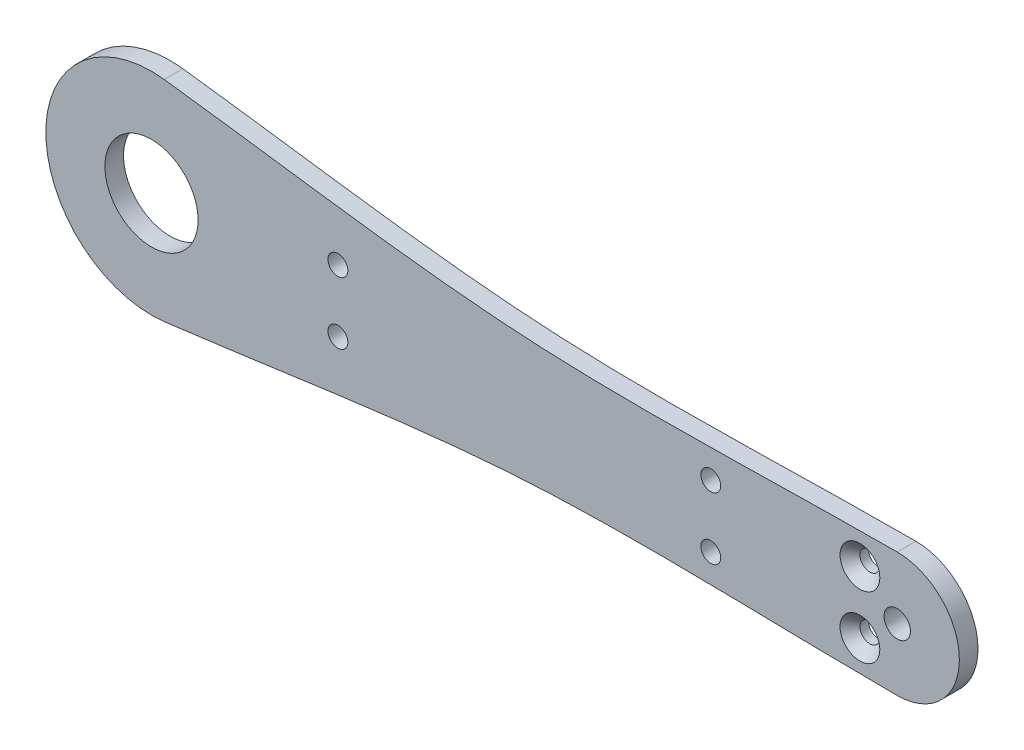
ISO-10303-21;
HEADER;
FILE_DESCRIPTION(('STEP AP214'),'2;1');
FILE_NAME('part.step','',(''),(''),'','','');
FILE_SCHEMA(('AUTOMOTIVE_DESIGN { 1 0 10303 214 1 1 1 1 }'));
ENDSEC;
DATA;
#1=APPLICATION_CONTEXT('core data for automotive mechanical design processes');
#2=APPLICATION_PROTOCOL_DEFINITION('international standard','automotive_design',2000,#1);
#3=PRODUCT_CONTEXT('',#1,'mechanical');
#4=PRODUCT('Part','Part','',(#3));
#5=PRODUCT_RELATED_PRODUCT_CATEGORY('part','',(#4));
#6=PRODUCT_DEFINITION_FORMATION('','',#4);
#7=PRODUCT_DEFINITION_CONTEXT('part definition',#1,'design');
#8=PRODUCT_DEFINITION('design','',#6,#7);
#9=PRODUCT_DEFINITION_SHAPE('','',#8);
#10=(LENGTH_UNIT() NAMED_UNIT(*) SI_UNIT(.MILLI.,.METRE.));
#11=(NAMED_UNIT(*) PLANE_ANGLE_UNIT() SI_UNIT($,.RADIAN.));
#12=(NAMED_UNIT(*) SI_UNIT($,.STERADIAN.) SOLID_ANGLE_UNIT());
#13=UNCERTAINTY_MEASURE_WITH_UNIT(LENGTH_MEASURE(1.E-05),#10,'distance_accuracy_value','');
#14=(GEOMETRIC_REPRESENTATION_CONTEXT(3) GLOBAL_UNCERTAINTY_ASSIGNED_CONTEXT((#13)) GLOBAL_UNIT_ASSIGNED_CONTEXT((#10,
#11,#12)) REPRESENTATION_CONTEXT('',''));
#15=CARTESIAN_POINT('',(0.,0.,0.));
#16=DIRECTION('',(0.,0.,1.));
#17=DIRECTION('',(1.,0.,0.));
#18=AXIS2_PLACEMENT_3D('',#15,#16,#17);
#19=CARTESIAN_POINT('',(0.814450710924404,-9.95346001606497,3.));
#20=DIRECTION('',(0.,0.,1.));
#21=DIRECTION('',(1.,0.,0.));
#22=AXIS2_PLACEMENT_3D('',#19,#20,#21);
#23=PLANE('',#22);
#24=CARTESIAN_POINT('',(54.,-4.99999999999999,3.));
#25=DIRECTION('',(0.,0.,1.));
#26=DIRECTION('',(1.,0.,0.));
#27=AXIS2_PLACEMENT_3D('',#24,#25,#26);
#28=CIRCLE('',#27,3.20000000000001);
#29=CARTESIAN_POINT('',(57.2,-4.99999999999999,3.));
#30=VERTEX_POINT('',#29);
#31=EDGE_CURVE('E51',#30,#30,#28,.F.);
#32=ORIENTED_EDGE('',*,*,#31,.T.);
#33=EDGE_LOOP('',(#32));
#34=FACE_BOUND('',#33,.T.);
#35=CARTESIAN_POINT('',(54.,5.,3.));
#36=DIRECTION('',(0.,0.,1.));
#37=DIRECTION('',(1.,0.,0.));
#38=AXIS2_PLACEMENT_3D('',#35,#36,#37);
#39=CIRCLE('',#38,3.20000000000001);
#40=CARTESIAN_POINT('',(57.2,5.,3.));
#41=VERTEX_POINT('',#40);
#42=EDGE_CURVE('E327',#41,#41,#39,.F.);
#43=ORIENTED_EDGE('',*,*,#42,.T.);
#44=EDGE_LOOP('',(#43));
#45=FACE_BOUND('',#44,.T.);
#46=CARTESIAN_POINT('',(30.,-5.,3.));
#47=DIRECTION('',(0.,0.,1.));
#48=DIRECTION('',(1.,0.,0.));
#49=AXIS2_PLACEMENT_3D('',#46,#47,#48);
#50=CIRCLE('',#49,1.6);
#51=CARTESIAN_POINT('',(31.6,-5.,3.));
#52=VERTEX_POINT('',#51);
#53=EDGE_CURVE('E159',#52,#52,#50,.T.);
#54=ORIENTED_EDGE('',*,*,#53,.F.);
#55=EDGE_LOOP('',(#54));
#56=FACE_BOUND('',#55,.T.);
#57=CARTESIAN_POINT('',(60.,0.,3.));
#58=DIRECTION('',(0.,0.,1.));
#59=DIRECTION('',(-1.,0.,0.));
#60=AXIS2_PLACEMENT_3D('',#57,#58,#59);
#61=CIRCLE('',#60,2.125);
#62=CARTESIAN_POINT('',(57.875,0.,3.));
#63=VERTEX_POINT('',#62);
#64=EDGE_CURVE('E146',#63,#63,#61,.T.);
#65=ORIENTED_EDGE('',*,*,#64,.F.);
#66=EDGE_LOOP('',(#65));
#67=FACE_BOUND('',#66,.T.);
#68=CARTESIAN_POINT('',(-30.0000000000001,5.,3.));
#69=DIRECTION('',(0.,0.,1.));
#70=DIRECTION('',(1.,0.,0.));
#71=AXIS2_PLACEMENT_3D('',#68,#69,#70);
#72=CIRCLE('',#71,1.6);
#73=CARTESIAN_POINT('',(-28.4000000000001,5.,3.));
#74=VERTEX_POINT('',#73);
#75=EDGE_CURVE('E137',#74,#74,#72,.T.);
#76=ORIENTED_EDGE('',*,*,#75,.F.);
#77=EDGE_LOOP('',(#76));
#78=FACE_BOUND('',#77,.T.);
#79=CARTESIAN_POINT('',(-57.9568290070721,-16.8767725674567,3.));
#80=CARTESIAN_POINT('',(-38.5984780231674,-14.4869497914735,3.));
#81=CARTESIAN_POINT('',(0.415985337574771,-7.69361377576714,3.));
#82=CARTESIAN_POINT('',(39.9382795170154,-10.,3.));
#83=CARTESIAN_POINT('',(60.,-10.,3.));
#84=B_SPLINE_CURVE_WITH_KNOTS('',3,(#79,#80,#81,#82,#83),.UNSPECIFIED.,.F.,.F.,(4,1,4),(0.,
0.493086456175555,1.),.UNSPECIFIED.);
#85=CARTESIAN_POINT('',(-57.9568290070721,-16.8767725674567,3.));
#86=VERTEX_POINT('',#85);
#87=CARTESIAN_POINT('',(60.,-9.99999999999999,3.));
#88=VERTEX_POINT('',#87);
#89=EDGE_CURVE('E92',#86,#88,#84,.T.);
#90=ORIENTED_EDGE('',*,*,#89,.T.);
#91=CARTESIAN_POINT('',(60.,0.,3.));
#92=DIRECTION('',(0.,0.,1.));
#93=DIRECTION('',(1.,0.,0.));
#94=AXIS2_PLACEMENT_3D('',#91,#92,#93);
#95=CIRCLE('',#94,10.);
#96=CARTESIAN_POINT('',(60.,10.,3.));
#97=VERTEX_POINT('',#96);
#98=EDGE_CURVE('E89',#88,#97,#95,.T.);
#99=ORIENTED_EDGE('',*,*,#98,.T.);
#100=CARTESIAN_POINT('',(60.,10.,3.));
#101=CARTESIAN_POINT('',(39.9382795170154,10.,3.));
#102=CARTESIAN_POINT('',(0.415985337574768,7.69361377576714,3.));
#103=CARTESIAN_POINT('',(-38.5984780231674,14.4869497914735,3.));
#104=CARTESIAN_POINT('',(-57.9568290070721,16.8767725674567,3.));
#105=B_SPLINE_CURVE_WITH_KNOTS('',3,(#100,#101,#102,#103,#104),.UNSPECIFIED.,.F.,.F.,(4,1,4),
(0.,0.506913543824445,1.),.UNSPECIFIED.);
#106=CARTESIAN_POINT('',(-57.9568290070721,16.8767725674567,3.));
#107=VERTEX_POINT('',#106);
#108=EDGE_CURVE('E91',#97,#107,#105,.T.);
#109=ORIENTED_EDGE('',*,*,#108,.T.);
#110=CARTESIAN_POINT('',(-60.,0.,3.));
#111=DIRECTION('',(0.,0.,1.));
#112=DIRECTION('',(1.,0.,0.));
#113=AXIS2_PLACEMENT_3D('',#110,#111,#112);
#114=CIRCLE('',#113,17.);
#115=EDGE_CURVE('E56',#107,#86,#114,.T.);
#116=ORIENTED_EDGE('',*,*,#115,.T.);
#117=EDGE_LOOP('',(#90,#99,#109,#116));
#118=FACE_BOUND('',#117,.T.);
#119=CARTESIAN_POINT('',(-60.,0.,3.));
#120=DIRECTION('',(0.,0.,1.));
#121=DIRECTION('',(1.,0.,0.));
#122=AXIS2_PLACEMENT_3D('',#119,#120,#121);
#123=CIRCLE('',#122,7.5);
#124=CARTESIAN_POINT('',(-52.5,0.,3.));
#125=VERTEX_POINT('',#124);
#126=EDGE_CURVE('E143',#125,#125,#123,.T.);
#127=ORIENTED_EDGE('',*,*,#126,.F.);
#128=EDGE_LOOP('',(#127));
#129=FACE_BOUND('',#128,.T.);
#130=CARTESIAN_POINT('',(30.,5.,3.));
#131=DIRECTION('',(0.,0.,1.));
#132=DIRECTION('',(1.,0.,0.));
#133=AXIS2_PLACEMENT_3D('',#130,#131,#132);
#134=CIRCLE('',#133,1.6);
#135=CARTESIAN_POINT('',(31.6,5.,3.));
#136=VERTEX_POINT('',#135);
#137=EDGE_CURVE('E152',#136,#136,#134,.T.);
#138=ORIENTED_EDGE('',*,*,#137,.F.);
#139=EDGE_LOOP('',(#138));
#140=FACE_BOUND('',#139,.T.);
#141=CARTESIAN_POINT('',(-30.,-5.,3.));
#142=DIRECTION('',(0.,0.,1.));
#143=DIRECTION('',(1.,0.,0.));
#144=AXIS2_PLACEMENT_3D('',#141,#142,#143);
#145=CIRCLE('',#144,1.6);
#146=CARTESIAN_POINT('',(-28.4,-5.,3.));
#147=VERTEX_POINT('',#146);
#148=EDGE_CURVE('E167',#147,#147,#145,.T.);
#149=ORIENTED_EDGE('',*,*,#148,.F.);
#150=EDGE_LOOP('',(#149));
#151=FACE_BOUND('',#150,.T.);
#152=ADVANCED_FACE('F41',(#34,#45,#56,#67,#78,#118,#129,#140,#151),#23,.T.);
#153=CARTESIAN_POINT('',(0.814450710924404,-9.95346001606497,0.));
#154=DIRECTION('',(0.,0.,1.));
#155=DIRECTION('',(1.,0.,0.));
#156=AXIS2_PLACEMENT_3D('',#153,#154,#155);
#157=PLANE('',#156);
#158=CARTESIAN_POINT('',(54.,5.,0.));
#159=DIRECTION('',(0.,0.,1.));
#160=DIRECTION('',(1.,0.,0.));
#161=AXIS2_PLACEMENT_3D('',#158,#159,#160);
#162=CIRCLE('',#161,1.6);
#163=CARTESIAN_POINT('',(55.6,5.,0.));
#164=VERTEX_POINT('',#163);
#165=EDGE_CURVE('E174',#164,#164,#162,.T.);
#166=ORIENTED_EDGE('',*,*,#165,.T.);
#167=EDGE_LOOP('',(#166));
#168=FACE_BOUND('',#167,.T.);
#169=CARTESIAN_POINT('',(54.,-4.99999999999999,0.));
#170=DIRECTION('',(0.,0.,1.));
#171=DIRECTION('',(-1.,0.,0.));
#172=AXIS2_PLACEMENT_3D('',#169,#170,#171);
#173=CIRCLE('',#172,1.6);
#174=CARTESIAN_POINT('',(52.4,-4.99999999999999,0.));
#175=VERTEX_POINT('',#174);
#176=EDGE_CURVE('E173',#175,#175,#173,.T.);
#177=ORIENTED_EDGE('',*,*,#176,.T.);
#178=EDGE_LOOP('',(#177));
#179=FACE_BOUND('',#178,.T.);
#180=CARTESIAN_POINT('',(-57.9568290070721,-16.8767725674567,0.));
#181=CARTESIAN_POINT('',(-38.5984780231674,-14.4869497914735,0.));
#182=CARTESIAN_POINT('',(0.415985337574771,-7.69361377576714,0.));
#183=CARTESIAN_POINT('',(39.9382795170154,-10.,0.));
#184=CARTESIAN_POINT('',(60.,-10.,0.));
#185=B_SPLINE_CURVE_WITH_KNOTS('',3,(#180,#181,#182,#183,#184),.UNSPECIFIED.,.F.,.F.,(4,1,4),
(0.,0.493086456175555,1.),.UNSPECIFIED.);
#186=CARTESIAN_POINT('',(-57.9568290070721,-16.8767725674567,0.));
#187=VERTEX_POINT('',#186);
#188=CARTESIAN_POINT('',(60.,-9.99999999999999,0.));
#189=VERTEX_POINT('',#188);
#190=EDGE_CURVE('E145',#187,#189,#185,.T.);
#191=ORIENTED_EDGE('',*,*,#190,.F.);
#192=CARTESIAN_POINT('',(-60.,0.,0.));
#193=DIRECTION('',(0.,0.,1.));
#194=DIRECTION('',(1.,0.,0.));
#195=AXIS2_PLACEMENT_3D('',#192,#193,#194);
#196=CIRCLE('',#195,17.);
#197=CARTESIAN_POINT('',(-57.9568290070721,16.8767725674567,0.));
#198=VERTEX_POINT('',#197);
#199=EDGE_CURVE('E81',#198,#187,#196,.T.);
#200=ORIENTED_EDGE('',*,*,#199,.F.);
#201=CARTESIAN_POINT('',(60.,10.,0.));
#202=CARTESIAN_POINT('',(39.9382795170154,10.,0.));
#203=CARTESIAN_POINT('',(0.415985337574768,7.69361377576714,0.));
#204=CARTESIAN_POINT('',(-38.5984780231674,14.4869497914735,0.));
#205=CARTESIAN_POINT('',(-57.9568290070721,16.8767725674567,0.));
#206=B_SPLINE_CURVE_WITH_KNOTS('',3,(#201,#202,#203,#204,#205),.UNSPECIFIED.,.F.,.F.,(4,1,4),
(0.,0.506913543824445,1.),.UNSPECIFIED.);
#207=CARTESIAN_POINT('',(60.,10.,0.));
#208=VERTEX_POINT('',#207);
#209=EDGE_CURVE('E77',#208,#198,#206,.T.);
#210=ORIENTED_EDGE('',*,*,#209,.F.);
#211=CARTESIAN_POINT('',(60.,0.,0.));
#212=DIRECTION('',(0.,0.,1.));
#213=DIRECTION('',(1.,0.,0.));
#214=AXIS2_PLACEMENT_3D('',#211,#212,#213);
#215=CIRCLE('',#214,10.);
#216=EDGE_CURVE('E99',#189,#208,#215,.T.);
#217=ORIENTED_EDGE('',*,*,#216,.F.);
#218=EDGE_LOOP('',(#191,#200,#210,#217));
#219=FACE_BOUND('',#218,.T.);
#220=CARTESIAN_POINT('',(-30.0000000000001,5.,0.));
#221=DIRECTION('',(0.,0.,1.));
#222=DIRECTION('',(1.,0.,0.));
#223=AXIS2_PLACEMENT_3D('',#220,#221,#222);
#224=CIRCLE('',#223,1.6);
#225=CARTESIAN_POINT('',(-28.4000000000001,5.,0.));
#226=VERTEX_POINT('',#225);
#227=EDGE_CURVE('E131',#226,#226,#224,.T.);
#228=ORIENTED_EDGE('',*,*,#227,.T.);
#229=EDGE_LOOP('',(#228));
#230=FACE_BOUND('',#229,.T.);
#231=CARTESIAN_POINT('',(-60.,0.,0.));
#232=DIRECTION('',(0.,0.,1.));
#233=DIRECTION('',(1.,0.,0.));
#234=AXIS2_PLACEMENT_3D('',#231,#232,#233);
#235=CIRCLE('',#234,7.5);
#236=CARTESIAN_POINT('',(-52.5,0.,0.));
#237=VERTEX_POINT('',#236);
#238=EDGE_CURVE('E144',#237,#237,#235,.T.);
#239=ORIENTED_EDGE('',*,*,#238,.T.);
#240=EDGE_LOOP('',(#239));
#241=FACE_BOUND('',#240,.T.);
#242=CARTESIAN_POINT('',(60.,0.,0.));
#243=DIRECTION('',(0.,0.,1.));
#244=DIRECTION('',(-1.,0.,0.));
#245=AXIS2_PLACEMENT_3D('',#242,#243,#244);
#246=CIRCLE('',#245,2.125);
#247=CARTESIAN_POINT('',(57.875,0.,0.));
#248=VERTEX_POINT('',#247);
#249=EDGE_CURVE('E151',#248,#248,#246,.T.);
#250=ORIENTED_EDGE('',*,*,#249,.T.);
#251=EDGE_LOOP('',(#250));
#252=FACE_BOUND('',#251,.T.);
#253=CARTESIAN_POINT('',(30.,5.,0.));
#254=DIRECTION('',(0.,0.,1.));
#255=DIRECTION('',(1.,0.,0.));
#256=AXIS2_PLACEMENT_3D('',#253,#254,#255);
#257=CIRCLE('',#256,1.6);
#258=CARTESIAN_POINT('',(31.6,5.,0.));
#259=VERTEX_POINT('',#258);
#260=EDGE_CURVE('E160',#259,#259,#257,.T.);
#261=ORIENTED_EDGE('',*,*,#260,.T.);
#262=EDGE_LOOP('',(#261));
#263=FACE_BOUND('',#262,.T.);
#264=CARTESIAN_POINT('',(30.,-5.,0.));
#265=DIRECTION('',(0.,0.,1.));
#266=DIRECTION('',(1.,0.,0.));
#267=AXIS2_PLACEMENT_3D('',#264,#265,#266);
#268=CIRCLE('',#267,1.6);
#269=CARTESIAN_POINT('',(31.6,-5.,0.));
#270=VERTEX_POINT('',#269);
#271=EDGE_CURVE('E162',#270,#270,#268,.T.);
#272=ORIENTED_EDGE('',*,*,#271,.T.);
#273=EDGE_LOOP('',(#272));
#274=FACE_BOUND('',#273,.T.);
#275=CARTESIAN_POINT('',(-30.,-5.,0.));
#276=DIRECTION('',(0.,0.,1.));
#277=DIRECTION('',(1.,0.,0.));
#278=AXIS2_PLACEMENT_3D('',#275,#276,#277);
#279=CIRCLE('',#278,1.6);
#280=CARTESIAN_POINT('',(-28.4,-5.,0.));
#281=VERTEX_POINT('',#280);
#282=EDGE_CURVE('E166',#281,#281,#279,.T.);
#283=ORIENTED_EDGE('',*,*,#282,.T.);
#284=EDGE_LOOP('',(#283));
#285=FACE_BOUND('',#284,.T.);
#286=ADVANCED_FACE('F127',(#168,#179,#219,#230,#241,#252,#263,#274,#285),#157,.F.);
#287=DIRECTION('',(0.,0.,-1.));
#288=VECTOR('',#287,1.);
#289=SURFACE_OF_LINEAR_EXTRUSION('',#84,#288);
#290=ORIENTED_EDGE('',*,*,#190,.T.);
#291=DIRECTION('',(0.,0.,-1.));
#292=VECTOR('',#291,1.);
#293=CARTESIAN_POINT('',(60.,-9.99999999999999,3.));
#294=LINE('',#293,#292);
#295=EDGE_CURVE('E101',#88,#189,#294,.T.);
#296=ORIENTED_EDGE('',*,*,#295,.F.);
#297=ORIENTED_EDGE('',*,*,#89,.F.);
#298=DIRECTION('',(0.,0.,-1.));
#299=VECTOR('',#298,1.);
#300=CARTESIAN_POINT('',(-57.9568290070721,-16.8767725674567,3.));
#301=LINE('',#300,#299);
#302=EDGE_CURVE('E106',#86,#187,#301,.T.);
#303=ORIENTED_EDGE('',*,*,#302,.T.);
#304=EDGE_LOOP('',(#290,#296,#297,#303));
#305=FACE_BOUND('',#304,.T.);
#306=ADVANCED_FACE('F123',(#305),#289,.F.);
#307=CARTESIAN_POINT('',(60.,0.,3.));
#308=DIRECTION('',(0.,0.,-1.));
#309=DIRECTION('',(-1.,0.,0.));
#310=AXIS2_PLACEMENT_3D('',#307,#308,#309);
#311=CYLINDRICAL_SURFACE('',#310,10.);
#312=ORIENTED_EDGE('',*,*,#216,.T.);
#313=DIRECTION('',(0.,0.,-1.));
#314=VECTOR('',#313,1.);
#315=CARTESIAN_POINT('',(60.,10.,3.));
#316=LINE('',#315,#314);
#317=EDGE_CURVE('E98',#97,#208,#316,.T.);
#318=ORIENTED_EDGE('',*,*,#317,.F.);
#319=ORIENTED_EDGE('',*,*,#98,.F.);
#320=ORIENTED_EDGE('',*,*,#295,.T.);
#321=EDGE_LOOP('',(#312,#318,#319,#320));
#322=FACE_BOUND('',#321,.T.);
#323=ADVANCED_FACE('F97',(#322),#311,.T.);
#324=DIRECTION('',(0.,0.,-1.));
#325=VECTOR('',#324,1.);
#326=SURFACE_OF_LINEAR_EXTRUSION('',#105,#325);
#327=ORIENTED_EDGE('',*,*,#209,.T.);
#328=DIRECTION('',(0.,0.,-1.));
#329=VECTOR('',#328,1.);
#330=CARTESIAN_POINT('',(-57.9568290070721,16.8767725674567,3.));
#331=LINE('',#330,#329);
#332=EDGE_CURVE('E105',#107,#198,#331,.T.);
#333=ORIENTED_EDGE('',*,*,#332,.F.);
#334=ORIENTED_EDGE('',*,*,#108,.F.);
#335=ORIENTED_EDGE('',*,*,#317,.T.);
#336=EDGE_LOOP('',(#327,#333,#334,#335));
#337=FACE_BOUND('',#336,.T.);
#338=ADVANCED_FACE('F102',(#337),#326,.F.);
#339=CARTESIAN_POINT('',(-60.,0.,3.));
#340=DIRECTION('',(0.,0.,-1.));
#341=DIRECTION('',(-1.,0.,0.));
#342=AXIS2_PLACEMENT_3D('',#339,#340,#341);
#343=CYLINDRICAL_SURFACE('',#342,17.);
#344=ORIENTED_EDGE('',*,*,#199,.T.);
#345=ORIENTED_EDGE('',*,*,#302,.F.);
#346=ORIENTED_EDGE('',*,*,#115,.F.);
#347=ORIENTED_EDGE('',*,*,#332,.T.);
#348=EDGE_LOOP('',(#344,#345,#346,#347));
#349=FACE_BOUND('',#348,.T.);
#350=ADVANCED_FACE('F118',(#349),#343,.T.);
#351=CARTESIAN_POINT('',(-30.0000000000001,5.,3.));
#352=DIRECTION('',(0.,0.,-1.));
#353=DIRECTION('',(-1.,0.,0.));
#354=AXIS2_PLACEMENT_3D('',#351,#352,#353);
#355=CYLINDRICAL_SURFACE('',#354,1.6);
#356=ORIENTED_EDGE('',*,*,#75,.T.);
#357=EDGE_LOOP('',(#356));
#358=FACE_BOUND('',#357,.T.);
#359=ORIENTED_EDGE('',*,*,#227,.F.);
#360=EDGE_LOOP('',(#359));
#361=FACE_BOUND('',#360,.T.);
#362=ADVANCED_FACE('F202',(#358,#361),#355,.F.);
#363=CARTESIAN_POINT('',(-60.,0.,3.));
#364=DIRECTION('',(0.,0.,-1.));
#365=DIRECTION('',(-1.,0.,0.));
#366=AXIS2_PLACEMENT_3D('',#363,#364,#365);
#367=CYLINDRICAL_SURFACE('',#366,7.5);
#368=ORIENTED_EDGE('',*,*,#126,.T.);
#369=EDGE_LOOP('',(#368));
#370=FACE_BOUND('',#369,.T.);
#371=ORIENTED_EDGE('',*,*,#238,.F.);
#372=EDGE_LOOP('',(#371));
#373=FACE_BOUND('',#372,.T.);
#374=ADVANCED_FACE('F208',(#370,#373),#367,.F.);
#375=CARTESIAN_POINT('',(60.,0.,3.));
#376=DIRECTION('',(0.,0.,-1.));
#377=DIRECTION('',(-1.,0.,0.));
#378=AXIS2_PLACEMENT_3D('',#375,#376,#377);
#379=CYLINDRICAL_SURFACE('',#378,2.125);
#380=ORIENTED_EDGE('',*,*,#64,.T.);
#381=EDGE_LOOP('',(#380));
#382=FACE_BOUND('',#381,.T.);
#383=ORIENTED_EDGE('',*,*,#249,.F.);
#384=EDGE_LOOP('',(#383));
#385=FACE_BOUND('',#384,.T.);
#386=ADVANCED_FACE('F215',(#382,#385),#379,.F.);
#387=CARTESIAN_POINT('',(30.,5.,3.));
#388=DIRECTION('',(0.,0.,-1.));
#389=DIRECTION('',(-1.,0.,0.));
#390=AXIS2_PLACEMENT_3D('',#387,#388,#389);
#391=CYLINDRICAL_SURFACE('',#390,1.6);
#392=ORIENTED_EDGE('',*,*,#137,.T.);
#393=EDGE_LOOP('',(#392));
#394=FACE_BOUND('',#393,.T.);
#395=ORIENTED_EDGE('',*,*,#260,.F.);
#396=EDGE_LOOP('',(#395));
#397=FACE_BOUND('',#396,.T.);
#398=ADVANCED_FACE('F216',(#394,#397),#391,.F.);
#399=CARTESIAN_POINT('',(30.,-5.,3.));
#400=DIRECTION('',(0.,0.,-1.));
#401=DIRECTION('',(-1.,0.,0.));
#402=AXIS2_PLACEMENT_3D('',#399,#400,#401);
#403=CYLINDRICAL_SURFACE('',#402,1.6);
#404=ORIENTED_EDGE('',*,*,#53,.T.);
#405=EDGE_LOOP('',(#404));
#406=FACE_BOUND('',#405,.T.);
#407=ORIENTED_EDGE('',*,*,#271,.F.);
#408=EDGE_LOOP('',(#407));
#409=FACE_BOUND('',#408,.T.);
#410=ADVANCED_FACE('F219',(#406,#409),#403,.F.);
#411=CARTESIAN_POINT('',(-30.,-5.,3.));
#412=DIRECTION('',(0.,0.,-1.));
#413=DIRECTION('',(-1.,0.,0.));
#414=AXIS2_PLACEMENT_3D('',#411,#412,#413);
#415=CYLINDRICAL_SURFACE('',#414,1.6);
#416=ORIENTED_EDGE('',*,*,#148,.T.);
#417=EDGE_LOOP('',(#416));
#418=FACE_BOUND('',#417,.T.);
#419=ORIENTED_EDGE('',*,*,#282,.F.);
#420=EDGE_LOOP('',(#419));
#421=FACE_BOUND('',#420,.T.);
#422=ADVANCED_FACE('F195',(#418,#421),#415,.F.);
#423=CARTESIAN_POINT('',(54.,-4.99999999999999,0.));
#424=DIRECTION('',(0.,0.,1.));
#425=DIRECTION('',(1.,0.,0.));
#426=AXIS2_PLACEMENT_3D('',#423,#424,#425);
#427=CYLINDRICAL_SURFACE('',#426,1.6);
#428=CARTESIAN_POINT('',(54.,-4.99999999999999,1.4));
#429=DIRECTION('',(0.,0.,1.));
#430=DIRECTION('',(1.,0.,0.));
#431=AXIS2_PLACEMENT_3D('',#428,#429,#430);
#432=CIRCLE('',#431,1.6);
#433=CARTESIAN_POINT('',(55.6,-4.99999999999999,1.4));
#434=VERTEX_POINT('',#433);
#435=EDGE_CURVE('E329',#434,#434,#432,.T.);
#436=ORIENTED_EDGE('',*,*,#435,.T.);
#437=EDGE_LOOP('',(#436));
#438=FACE_BOUND('',#437,.T.);
#439=ORIENTED_EDGE('',*,*,#176,.F.);
#440=EDGE_LOOP('',(#439));
#441=FACE_BOUND('',#440,.T.);
#442=ADVANCED_FACE('F183',(#438,#441),#427,.F.);
#443=CARTESIAN_POINT('',(54.,5.,0.));
#444=DIRECTION('',(0.,0.,1.));
#445=DIRECTION('',(1.,0.,0.));
#446=AXIS2_PLACEMENT_3D('',#443,#444,#445);
#447=CYLINDRICAL_SURFACE('',#446,1.6);
#448=CARTESIAN_POINT('',(54.,5.,1.4));
#449=DIRECTION('',(0.,0.,1.));
#450=DIRECTION('',(1.,0.,0.));
#451=AXIS2_PLACEMENT_3D('',#448,#449,#450);
#452=CIRCLE('',#451,1.6);
#453=CARTESIAN_POINT('',(55.6,5.,1.4));
#454=VERTEX_POINT('',#453);
#455=EDGE_CURVE('E11',#454,#454,#452,.T.);
#456=ORIENTED_EDGE('',*,*,#455,.T.);
#457=EDGE_LOOP('',(#456));
#458=FACE_BOUND('',#457,.T.);
#459=ORIENTED_EDGE('',*,*,#165,.F.);
#460=EDGE_LOOP('',(#459));
#461=FACE_BOUND('',#460,.T.);
#462=ADVANCED_FACE('F181',(#458,#461),#447,.F.);
#463=CARTESIAN_POINT('',(54.,-4.99999999999999,1.4));
#464=DIRECTION('',(0.,0.,1.));
#465=DIRECTION('',(1.,0.,0.));
#466=AXIS2_PLACEMENT_3D('',#463,#464,#465);
#467=CONICAL_SURFACE('',#466,1.6,0.785398163397451);
#468=ORIENTED_EDGE('',*,*,#31,.F.);
#469=EDGE_LOOP('',(#468));
#470=FACE_BOUND('',#469,.T.);
#471=ORIENTED_EDGE('',*,*,#435,.F.);
#472=EDGE_LOOP('',(#471));
#473=FACE_BOUND('',#472,.T.);
#474=ADVANCED_FACE('F129',(#470,#473),#467,.F.);
#475=CARTESIAN_POINT('',(54.,5.,1.4));
#476=DIRECTION('',(0.,0.,1.));
#477=DIRECTION('',(1.,0.,0.));
#478=AXIS2_PLACEMENT_3D('',#475,#476,#477);
#479=CONICAL_SURFACE('',#478,1.6,0.785398163397451);
#480=ORIENTED_EDGE('',*,*,#42,.F.);
#481=EDGE_LOOP('',(#480));
#482=FACE_BOUND('',#481,.T.);
#483=ORIENTED_EDGE('',*,*,#455,.F.);
#484=EDGE_LOOP('',(#483));
#485=FACE_BOUND('',#484,.T.);
#486=ADVANCED_FACE('F42',(#482,#485),#479,.F.);
#487=CLOSED_SHELL('',(#152,#286,#306,#323,#338,#350,#362,#374,#386,#398,#410,#422,#442,#462,
#474,#486));
#488=MANIFOLD_SOLID_BREP('B2',#487);
#489=ADVANCED_BREP_SHAPE_REPRESENTATION('',(#18,#488),#14);
#490=SHAPE_DEFINITION_REPRESENTATION(#9,#489);
ENDSEC;
END-ISO-10303-21;
